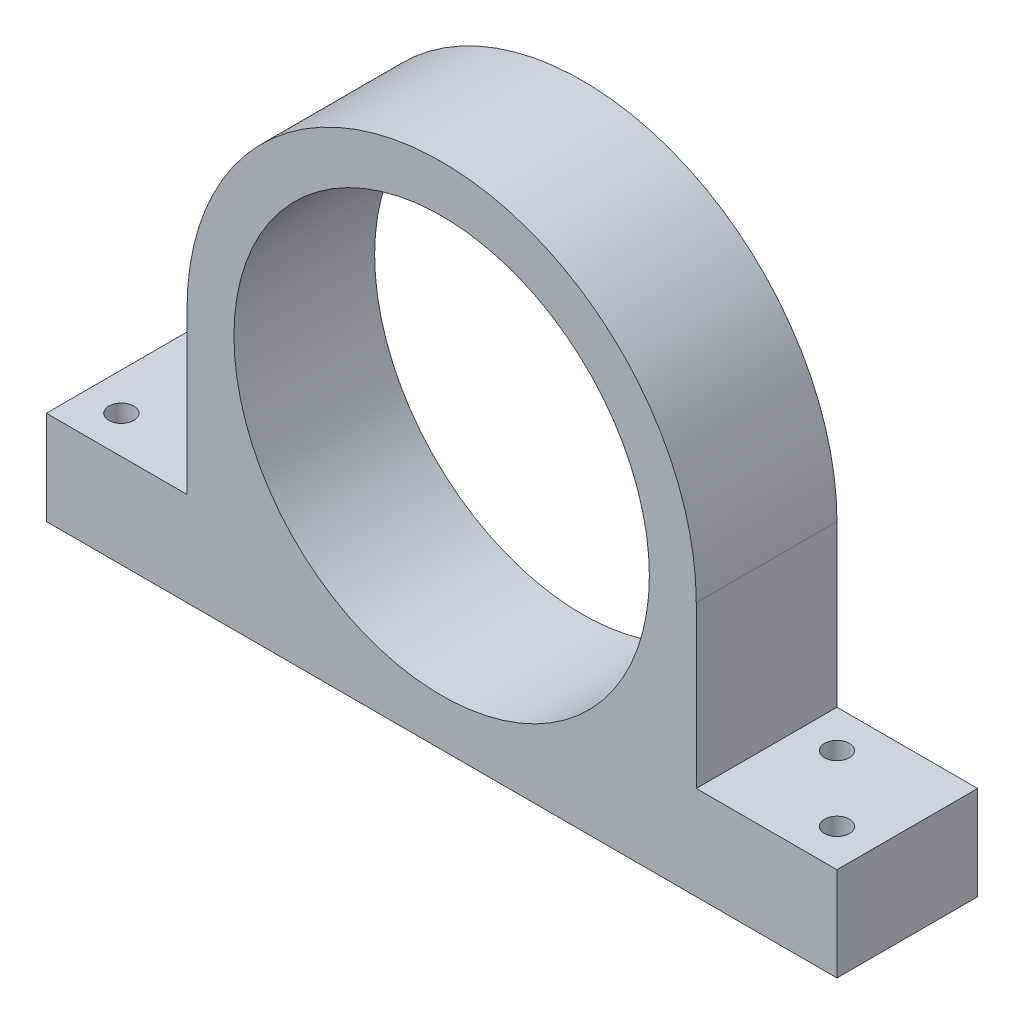
ISO-10303-21;
HEADER;
FILE_DESCRIPTION(('STEP AP214'),'2;1');
FILE_NAME('part.step','',(''),(''),'','','');
FILE_SCHEMA(('AUTOMOTIVE_DESIGN { 1 0 10303 214 1 1 1 1 }'));
ENDSEC;
DATA;
#1=APPLICATION_CONTEXT('core data for automotive mechanical design processes');
#2=APPLICATION_PROTOCOL_DEFINITION('international standard','automotive_design',2000,#1);
#3=PRODUCT_CONTEXT('',#1,'mechanical');
#4=PRODUCT('Part','Part','',(#3));
#5=PRODUCT_RELATED_PRODUCT_CATEGORY('part','',(#4));
#6=PRODUCT_DEFINITION_FORMATION('','',#4);
#7=PRODUCT_DEFINITION_CONTEXT('part definition',#1,'design');
#8=PRODUCT_DEFINITION('design','',#6,#7);
#9=PRODUCT_DEFINITION_SHAPE('','',#8);
#10=(LENGTH_UNIT() NAMED_UNIT(*) SI_UNIT(.MILLI.,.METRE.));
#11=(NAMED_UNIT(*) PLANE_ANGLE_UNIT() SI_UNIT($,.RADIAN.));
#12=(NAMED_UNIT(*) SI_UNIT($,.STERADIAN.) SOLID_ANGLE_UNIT());
#13=UNCERTAINTY_MEASURE_WITH_UNIT(LENGTH_MEASURE(1.E-05),#10,'distance_accuracy_value','');
#14=(GEOMETRIC_REPRESENTATION_CONTEXT(3) GLOBAL_UNCERTAINTY_ASSIGNED_CONTEXT((#13)) GLOBAL_UNIT_ASSIGNED_CONTEXT((#10,
#11,#12)) REPRESENTATION_CONTEXT('',''));
#15=CARTESIAN_POINT('',(0.,0.,0.));
#16=DIRECTION('',(0.,0.,1.));
#17=DIRECTION('',(1.,0.,0.));
#18=AXIS2_PLACEMENT_3D('',#15,#16,#17);
#19=CARTESIAN_POINT('',(0.,27.58059,7.62));
#20=DIRECTION('',(0.,0.,1.));
#21=DIRECTION('',(1.,0.,0.));
#22=AXIS2_PLACEMENT_3D('',#19,#20,#21);
#23=PLANE('',#22);
#24=CARTESIAN_POINT('',(0.,27.58059,7.62));
#25=DIRECTION('',(0.,0.,1.));
#26=DIRECTION('',(1.,0.,0.));
#27=AXIS2_PLACEMENT_3D('',#24,#25,#26);
#28=CIRCLE('',#27,27.58059);
#29=CARTESIAN_POINT('',(27.58059,27.58059,7.62));
#30=VERTEX_POINT('',#29);
#31=CARTESIAN_POINT('',(-27.58059,27.58059,7.62));
#32=VERTEX_POINT('',#31);
#33=EDGE_CURVE('E147',#30,#32,#28,.T.);
#34=ORIENTED_EDGE('',*,*,#33,.T.);
#35=DIRECTION('',(0.,-1.,0.));
#36=VECTOR('',#35,1.);
#37=CARTESIAN_POINT('',(-27.58059,27.58059,7.62));
#38=LINE('',#37,#36);
#39=CARTESIAN_POINT('',(-27.58059,10.16,7.62));
#40=VERTEX_POINT('',#39);
#41=EDGE_CURVE('E95',#32,#40,#38,.T.);
#42=ORIENTED_EDGE('',*,*,#41,.T.);
#43=DIRECTION('',(-1.,0.,0.));
#44=VECTOR('',#43,1.);
#45=CARTESIAN_POINT('',(-42.82059,10.16,7.62));
#46=LINE('',#45,#44);
#47=CARTESIAN_POINT('',(-42.82059,10.16,7.62));
#48=VERTEX_POINT('',#47);
#49=EDGE_CURVE('E162',#40,#48,#46,.T.);
#50=ORIENTED_EDGE('',*,*,#49,.T.);
#51=DIRECTION('',(0.,-1.,0.));
#52=VECTOR('',#51,1.);
#53=CARTESIAN_POINT('',(-42.82059,0.,7.62));
#54=LINE('',#53,#52);
#55=CARTESIAN_POINT('',(-42.82059,0.,7.62));
#56=VERTEX_POINT('',#55);
#57=EDGE_CURVE('E175',#48,#56,#54,.T.);
#58=ORIENTED_EDGE('',*,*,#57,.T.);
#59=DIRECTION('',(1.,0.,0.));
#60=VECTOR('',#59,1.);
#61=CARTESIAN_POINT('',(42.82059,0.,7.62));
#62=LINE('',#61,#60);
#63=CARTESIAN_POINT('',(42.82059,0.,7.62));
#64=VERTEX_POINT('',#63);
#65=EDGE_CURVE('E114',#56,#64,#62,.T.);
#66=ORIENTED_EDGE('',*,*,#65,.T.);
#67=DIRECTION('',(0.,1.,0.));
#68=VECTOR('',#67,1.);
#69=CARTESIAN_POINT('',(42.82059,0.,7.62));
#70=LINE('',#69,#68);
#71=CARTESIAN_POINT('',(42.82059,10.16,7.62));
#72=VERTEX_POINT('',#71);
#73=EDGE_CURVE('E108',#64,#72,#70,.T.);
#74=ORIENTED_EDGE('',*,*,#73,.T.);
#75=DIRECTION('',(-1.,0.,0.));
#76=VECTOR('',#75,1.);
#77=CARTESIAN_POINT('',(42.82059,10.16,7.62));
#78=LINE('',#77,#76);
#79=CARTESIAN_POINT('',(27.58059,10.16,7.62));
#80=VERTEX_POINT('',#79);
#81=EDGE_CURVE('E112',#72,#80,#78,.T.);
#82=ORIENTED_EDGE('',*,*,#81,.T.);
#83=DIRECTION('',(0.,1.,0.));
#84=VECTOR('',#83,1.);
#85=CARTESIAN_POINT('',(27.58059,27.58059,7.62));
#86=LINE('',#85,#84);
#87=EDGE_CURVE('E52',#80,#30,#86,.T.);
#88=ORIENTED_EDGE('',*,*,#87,.T.);
#89=EDGE_LOOP('',(#34,#42,#50,#58,#66,#74,#82,#88));
#90=FACE_BOUND('',#89,.T.);
#91=CARTESIAN_POINT('',(0.,27.58059,7.62));
#92=DIRECTION('',(0.,0.,1.));
#93=DIRECTION('',(1.,0.,0.));
#94=AXIS2_PLACEMENT_3D('',#91,#92,#93);
#95=CIRCLE('',#94,22.50059);
#96=CARTESIAN_POINT('',(-22.50059,27.58059,7.62));
#97=VERTEX_POINT('',#96);
#98=EDGE_CURVE('E136',#97,#97,#95,.T.);
#99=ORIENTED_EDGE('',*,*,#98,.F.);
#100=EDGE_LOOP('',(#99));
#101=FACE_BOUND('',#100,.T.);
#102=ADVANCED_FACE('F35',(#90,#101),#23,.T.);
#103=CARTESIAN_POINT('',(0.,27.58059,-7.62));
#104=DIRECTION('',(0.,0.,1.));
#105=DIRECTION('',(1.,0.,0.));
#106=AXIS2_PLACEMENT_3D('',#103,#104,#105);
#107=PLANE('',#106);
#108=CARTESIAN_POINT('',(0.,27.58059,-7.62));
#109=DIRECTION('',(0.,0.,1.));
#110=DIRECTION('',(1.,0.,0.));
#111=AXIS2_PLACEMENT_3D('',#108,#109,#110);
#112=CIRCLE('',#111,27.58059);
#113=CARTESIAN_POINT('',(27.58059,27.58059,-7.62));
#114=VERTEX_POINT('',#113);
#115=CARTESIAN_POINT('',(-27.58059,27.58059,-7.62));
#116=VERTEX_POINT('',#115);
#117=EDGE_CURVE('E132',#114,#116,#112,.T.);
#118=ORIENTED_EDGE('',*,*,#117,.F.);
#119=DIRECTION('',(0.,1.,0.));
#120=VECTOR('',#119,1.);
#121=CARTESIAN_POINT('',(27.58059,27.58059,-7.62));
#122=LINE('',#121,#120);
#123=CARTESIAN_POINT('',(27.58059,10.16,-7.62));
#124=VERTEX_POINT('',#123);
#125=EDGE_CURVE('E87',#124,#114,#122,.T.);
#126=ORIENTED_EDGE('',*,*,#125,.F.);
#127=DIRECTION('',(-1.,0.,0.));
#128=VECTOR('',#127,1.);
#129=CARTESIAN_POINT('',(42.82059,10.16,-7.62));
#130=LINE('',#129,#128);
#131=CARTESIAN_POINT('',(42.82059,10.16,-7.62));
#132=VERTEX_POINT('',#131);
#133=EDGE_CURVE('E81',#132,#124,#130,.T.);
#134=ORIENTED_EDGE('',*,*,#133,.F.);
#135=DIRECTION('',(0.,1.,0.));
#136=VECTOR('',#135,1.);
#137=CARTESIAN_POINT('',(42.82059,0.,-7.62));
#138=LINE('',#137,#136);
#139=CARTESIAN_POINT('',(42.82059,0.,-7.62));
#140=VERTEX_POINT('',#139);
#141=EDGE_CURVE('E122',#140,#132,#138,.T.);
#142=ORIENTED_EDGE('',*,*,#141,.F.);
#143=DIRECTION('',(1.,0.,0.));
#144=VECTOR('',#143,1.);
#145=CARTESIAN_POINT('',(42.82059,0.,-7.62));
#146=LINE('',#145,#144);
#147=CARTESIAN_POINT('',(-42.82059,0.,-7.62));
#148=VERTEX_POINT('',#147);
#149=EDGE_CURVE('E142',#148,#140,#146,.T.);
#150=ORIENTED_EDGE('',*,*,#149,.F.);
#151=DIRECTION('',(0.,-1.,0.));
#152=VECTOR('',#151,1.);
#153=CARTESIAN_POINT('',(-42.82059,0.,-7.62));
#154=LINE('',#153,#152);
#155=CARTESIAN_POINT('',(-42.82059,10.16,-7.62));
#156=VERTEX_POINT('',#155);
#157=EDGE_CURVE('E140',#156,#148,#154,.T.);
#158=ORIENTED_EDGE('',*,*,#157,.F.);
#159=DIRECTION('',(-1.,0.,0.));
#160=VECTOR('',#159,1.);
#161=CARTESIAN_POINT('',(-42.82059,10.16,-7.62));
#162=LINE('',#161,#160);
#163=CARTESIAN_POINT('',(-27.58059,10.16,-7.62));
#164=VERTEX_POINT('',#163);
#165=EDGE_CURVE('E138',#164,#156,#162,.T.);
#166=ORIENTED_EDGE('',*,*,#165,.F.);
#167=DIRECTION('',(0.,-1.,0.));
#168=VECTOR('',#167,1.);
#169=CARTESIAN_POINT('',(-27.58059,27.58059,-7.62));
#170=LINE('',#169,#168);
#171=EDGE_CURVE('E135',#116,#164,#170,.T.);
#172=ORIENTED_EDGE('',*,*,#171,.F.);
#173=EDGE_LOOP('',(#118,#126,#134,#142,#150,#158,#166,#172));
#174=FACE_BOUND('',#173,.T.);
#175=CARTESIAN_POINT('',(0.,27.58059,-7.62));
#176=DIRECTION('',(0.,0.,1.));
#177=DIRECTION('',(1.,0.,0.));
#178=AXIS2_PLACEMENT_3D('',#175,#176,#177);
#179=CIRCLE('',#178,22.50059);
#180=CARTESIAN_POINT('',(-22.50059,27.58059,-7.62));
#181=VERTEX_POINT('',#180);
#182=EDGE_CURVE('E181',#181,#181,#179,.T.);
#183=ORIENTED_EDGE('',*,*,#182,.T.);
#184=EDGE_LOOP('',(#183));
#185=FACE_BOUND('',#184,.T.);
#186=ADVANCED_FACE('F166',(#174,#185),#107,.F.);
#187=CARTESIAN_POINT('',(0.,27.58059,7.62));
#188=DIRECTION('',(0.,0.,-1.));
#189=DIRECTION('',(-1.,0.,0.));
#190=AXIS2_PLACEMENT_3D('',#187,#188,#189);
#191=CYLINDRICAL_SURFACE('',#190,27.58059);
#192=ORIENTED_EDGE('',*,*,#117,.T.);
#193=DIRECTION('',(0.,0.,-1.));
#194=VECTOR('',#193,1.);
#195=CARTESIAN_POINT('',(-27.58059,27.58059,7.62));
#196=LINE('',#195,#194);
#197=EDGE_CURVE('E11',#32,#116,#196,.T.);
#198=ORIENTED_EDGE('',*,*,#197,.F.);
#199=ORIENTED_EDGE('',*,*,#33,.F.);
#200=DIRECTION('',(0.,0.,-1.));
#201=VECTOR('',#200,1.);
#202=CARTESIAN_POINT('',(27.58059,27.58059,7.62));
#203=LINE('',#202,#201);
#204=EDGE_CURVE('E128',#30,#114,#203,.T.);
#205=ORIENTED_EDGE('',*,*,#204,.T.);
#206=EDGE_LOOP('',(#192,#198,#199,#205));
#207=FACE_BOUND('',#206,.T.);
#208=ADVANCED_FACE('F37',(#207),#191,.T.);
#209=CARTESIAN_POINT('',(-27.58059,27.58059,7.62));
#210=DIRECTION('',(1.,0.,0.));
#211=DIRECTION('',(0.,0.,-1.));
#212=AXIS2_PLACEMENT_3D('',#209,#210,#211);
#213=PLANE('',#212);
#214=ORIENTED_EDGE('',*,*,#171,.T.);
#215=DIRECTION('',(0.,0.,-1.));
#216=VECTOR('',#215,1.);
#217=CARTESIAN_POINT('',(-27.58059,10.16,7.62));
#218=LINE('',#217,#216);
#219=EDGE_CURVE('E44',#40,#164,#218,.T.);
#220=ORIENTED_EDGE('',*,*,#219,.F.);
#221=ORIENTED_EDGE('',*,*,#41,.F.);
#222=ORIENTED_EDGE('',*,*,#197,.T.);
#223=EDGE_LOOP('',(#214,#220,#221,#222));
#224=FACE_BOUND('',#223,.T.);
#225=ADVANCED_FACE('F215',(#224),#213,.F.);
#226=CARTESIAN_POINT('',(-42.82059,10.16,7.62));
#227=DIRECTION('',(0.,-1.,0.));
#228=DIRECTION('',(0.,0.,-1.));
#229=AXIS2_PLACEMENT_3D('',#226,#227,#228);
#230=PLANE('',#229);
#231=CARTESIAN_POINT('',(-38.75659,10.16,3.556));
#232=DIRECTION('',(0.,1.,0.));
#233=DIRECTION('',(0.,0.,1.));
#234=AXIS2_PLACEMENT_3D('',#231,#232,#233);
#235=CIRCLE('',#234,1.35254999999999);
#236=CARTESIAN_POINT('',(-38.75659,10.16,4.90854999999999));
#237=VERTEX_POINT('',#236);
#238=EDGE_CURVE('E207',#237,#237,#235,.T.);
#239=ORIENTED_EDGE('',*,*,#238,.F.);
#240=EDGE_LOOP('',(#239));
#241=FACE_BOUND('',#240,.T.);
#242=CARTESIAN_POINT('',(-31.64459,10.16,-3.556));
#243=DIRECTION('',(0.,1.,0.));
#244=DIRECTION('',(0.,0.,1.));
#245=AXIS2_PLACEMENT_3D('',#242,#243,#244);
#246=CIRCLE('',#245,1.35254999999999);
#247=CARTESIAN_POINT('',(-31.64459,10.16,-2.20345000000001));
#248=VERTEX_POINT('',#247);
#249=EDGE_CURVE('E201',#248,#248,#246,.T.);
#250=ORIENTED_EDGE('',*,*,#249,.F.);
#251=EDGE_LOOP('',(#250));
#252=FACE_BOUND('',#251,.T.);
#253=ORIENTED_EDGE('',*,*,#165,.T.);
#254=DIRECTION('',(0.,0.,-1.));
#255=VECTOR('',#254,1.);
#256=CARTESIAN_POINT('',(-42.82059,10.16,7.62));
#257=LINE('',#256,#255);
#258=EDGE_CURVE('E154',#48,#156,#257,.T.);
#259=ORIENTED_EDGE('',*,*,#258,.F.);
#260=ORIENTED_EDGE('',*,*,#49,.F.);
#261=ORIENTED_EDGE('',*,*,#219,.T.);
#262=EDGE_LOOP('',(#253,#259,#260,#261));
#263=FACE_BOUND('',#262,.T.);
#264=ADVANCED_FACE('F160',(#241,#252,#263),#230,.F.);
#265=CARTESIAN_POINT('',(-42.82059,0.,7.62));
#266=DIRECTION('',(1.,0.,0.));
#267=DIRECTION('',(0.,0.,-1.));
#268=AXIS2_PLACEMENT_3D('',#265,#266,#267);
#269=PLANE('',#268);
#270=ORIENTED_EDGE('',*,*,#157,.T.);
#271=DIRECTION('',(0.,0.,-1.));
#272=VECTOR('',#271,1.);
#273=CARTESIAN_POINT('',(-42.82059,0.,7.62));
#274=LINE('',#273,#272);
#275=EDGE_CURVE('E151',#56,#148,#274,.T.);
#276=ORIENTED_EDGE('',*,*,#275,.F.);
#277=ORIENTED_EDGE('',*,*,#57,.F.);
#278=ORIENTED_EDGE('',*,*,#258,.T.);
#279=EDGE_LOOP('',(#270,#276,#277,#278));
#280=FACE_BOUND('',#279,.T.);
#281=ADVANCED_FACE('F171',(#280),#269,.F.);
#282=CARTESIAN_POINT('',(42.82059,0.,7.62));
#283=DIRECTION('',(0.,1.,0.));
#284=DIRECTION('',(-1.,0.,0.));
#285=AXIS2_PLACEMENT_3D('',#282,#283,#284);
#286=PLANE('',#285);
#287=CARTESIAN_POINT('',(-38.75659,0.,3.556));
#288=DIRECTION('',(0.,1.,0.));
#289=DIRECTION('',(0.,0.,1.));
#290=AXIS2_PLACEMENT_3D('',#287,#288,#289);
#291=CIRCLE('',#290,1.35255);
#292=CARTESIAN_POINT('',(-38.75659,0.,4.90855));
#293=VERTEX_POINT('',#292);
#294=EDGE_CURVE('E204',#293,#293,#291,.T.);
#295=ORIENTED_EDGE('',*,*,#294,.T.);
#296=EDGE_LOOP('',(#295));
#297=FACE_BOUND('',#296,.T.);
#298=CARTESIAN_POINT('',(-31.64459,0.,-3.556));
#299=DIRECTION('',(0.,1.,0.));
#300=DIRECTION('',(0.,0.,1.));
#301=AXIS2_PLACEMENT_3D('',#298,#299,#300);
#302=CIRCLE('',#301,1.35255);
#303=CARTESIAN_POINT('',(-31.64459,0.,-2.20345));
#304=VERTEX_POINT('',#303);
#305=EDGE_CURVE('E198',#304,#304,#302,.T.);
#306=ORIENTED_EDGE('',*,*,#305,.T.);
#307=EDGE_LOOP('',(#306));
#308=FACE_BOUND('',#307,.T.);
#309=CARTESIAN_POINT('',(31.64459,0.,-3.556));
#310=DIRECTION('',(0.,1.,0.));
#311=DIRECTION('',(0.,0.,1.));
#312=AXIS2_PLACEMENT_3D('',#309,#310,#311);
#313=CIRCLE('',#312,1.35255);
#314=CARTESIAN_POINT('',(31.64459,0.,-2.20345));
#315=VERTEX_POINT('',#314);
#316=EDGE_CURVE('E192',#315,#315,#313,.T.);
#317=ORIENTED_EDGE('',*,*,#316,.T.);
#318=EDGE_LOOP('',(#317));
#319=FACE_BOUND('',#318,.T.);
#320=CARTESIAN_POINT('',(38.75659,0.,3.556));
#321=DIRECTION('',(0.,1.,0.));
#322=DIRECTION('',(0.,0.,1.));
#323=AXIS2_PLACEMENT_3D('',#320,#321,#322);
#324=CIRCLE('',#323,1.35255);
#325=CARTESIAN_POINT('',(38.75659,0.,4.90855));
#326=VERTEX_POINT('',#325);
#327=EDGE_CURVE('E184',#326,#326,#324,.T.);
#328=ORIENTED_EDGE('',*,*,#327,.T.);
#329=EDGE_LOOP('',(#328));
#330=FACE_BOUND('',#329,.T.);
#331=ORIENTED_EDGE('',*,*,#149,.T.);
#332=DIRECTION('',(0.,0.,-1.));
#333=VECTOR('',#332,1.);
#334=CARTESIAN_POINT('',(42.82059,0.,7.62));
#335=LINE('',#334,#333);
#336=EDGE_CURVE('E123',#64,#140,#335,.T.);
#337=ORIENTED_EDGE('',*,*,#336,.F.);
#338=ORIENTED_EDGE('',*,*,#65,.F.);
#339=ORIENTED_EDGE('',*,*,#275,.T.);
#340=EDGE_LOOP('',(#331,#337,#338,#339));
#341=FACE_BOUND('',#340,.T.);
#342=ADVANCED_FACE('F174',(#297,#308,#319,#330,#341),#286,.F.);
#343=CARTESIAN_POINT('',(42.82059,0.,7.62));
#344=DIRECTION('',(-1.,0.,0.));
#345=DIRECTION('',(0.,0.,1.));
#346=AXIS2_PLACEMENT_3D('',#343,#344,#345);
#347=PLANE('',#346);
#348=ORIENTED_EDGE('',*,*,#141,.T.);
#349=DIRECTION('',(0.,0.,-1.));
#350=VECTOR('',#349,1.);
#351=CARTESIAN_POINT('',(42.82059,10.16,7.62));
#352=LINE('',#351,#350);
#353=EDGE_CURVE('E119',#72,#132,#352,.T.);
#354=ORIENTED_EDGE('',*,*,#353,.F.);
#355=ORIENTED_EDGE('',*,*,#73,.F.);
#356=ORIENTED_EDGE('',*,*,#336,.T.);
#357=EDGE_LOOP('',(#348,#354,#355,#356));
#358=FACE_BOUND('',#357,.T.);
#359=ADVANCED_FACE('F120',(#358),#347,.F.);
#360=CARTESIAN_POINT('',(42.82059,10.16,7.62));
#361=DIRECTION('',(0.,-1.,0.));
#362=DIRECTION('',(0.,0.,-1.));
#363=AXIS2_PLACEMENT_3D('',#360,#361,#362);
#364=PLANE('',#363);
#365=CARTESIAN_POINT('',(31.64459,10.16,-3.556));
#366=DIRECTION('',(0.,1.,0.));
#367=DIRECTION('',(0.,0.,1.));
#368=AXIS2_PLACEMENT_3D('',#365,#366,#367);
#369=CIRCLE('',#368,1.35254999999999);
#370=CARTESIAN_POINT('',(31.64459,10.16,-2.20345000000001));
#371=VERTEX_POINT('',#370);
#372=EDGE_CURVE('E195',#371,#371,#369,.T.);
#373=ORIENTED_EDGE('',*,*,#372,.F.);
#374=EDGE_LOOP('',(#373));
#375=FACE_BOUND('',#374,.T.);
#376=CARTESIAN_POINT('',(38.75659,10.16,3.556));
#377=DIRECTION('',(0.,1.,0.));
#378=DIRECTION('',(0.,0.,1.));
#379=AXIS2_PLACEMENT_3D('',#376,#377,#378);
#380=CIRCLE('',#379,1.35254999999999);
#381=CARTESIAN_POINT('',(38.75659,10.16,4.90854999999999));
#382=VERTEX_POINT('',#381);
#383=EDGE_CURVE('E189',#382,#382,#380,.T.);
#384=ORIENTED_EDGE('',*,*,#383,.F.);
#385=EDGE_LOOP('',(#384));
#386=FACE_BOUND('',#385,.T.);
#387=ORIENTED_EDGE('',*,*,#133,.T.);
#388=DIRECTION('',(0.,0.,-1.));
#389=VECTOR('',#388,1.);
#390=CARTESIAN_POINT('',(27.58059,10.16,7.62));
#391=LINE('',#390,#389);
#392=EDGE_CURVE('E124',#80,#124,#391,.T.);
#393=ORIENTED_EDGE('',*,*,#392,.F.);
#394=ORIENTED_EDGE('',*,*,#81,.F.);
#395=ORIENTED_EDGE('',*,*,#353,.T.);
#396=EDGE_LOOP('',(#387,#393,#394,#395));
#397=FACE_BOUND('',#396,.T.);
#398=ADVANCED_FACE('F126',(#375,#386,#397),#364,.F.);
#399=CARTESIAN_POINT('',(27.58059,27.58059,7.62));
#400=DIRECTION('',(-1.,0.,0.));
#401=DIRECTION('',(0.,-1.,0.));
#402=AXIS2_PLACEMENT_3D('',#399,#400,#401);
#403=PLANE('',#402);
#404=ORIENTED_EDGE('',*,*,#125,.T.);
#405=ORIENTED_EDGE('',*,*,#204,.F.);
#406=ORIENTED_EDGE('',*,*,#87,.F.);
#407=ORIENTED_EDGE('',*,*,#392,.T.);
#408=EDGE_LOOP('',(#404,#405,#406,#407));
#409=FACE_BOUND('',#408,.T.);
#410=ADVANCED_FACE('F244',(#409),#403,.F.);
#411=CARTESIAN_POINT('',(0.,27.58059,7.62));
#412=DIRECTION('',(0.,0.,-1.));
#413=DIRECTION('',(-1.,0.,0.));
#414=AXIS2_PLACEMENT_3D('',#411,#412,#413);
#415=CYLINDRICAL_SURFACE('',#414,22.50059);
#416=CARTESIAN_POINT('',(-22.50059,27.58059,7.62));
#417=CARTESIAN_POINT('',(-22.50059,27.58059,7.46125));
#418=CARTESIAN_POINT('',(-22.50059,27.58059,7.3025));
#419=CARTESIAN_POINT('',(-22.50059,27.58059,6.985));
#420=CARTESIAN_POINT('',(-22.50059,27.58059,6.82625));
#421=CARTESIAN_POINT('',(-22.50059,27.58059,6.50875));
#422=CARTESIAN_POINT('',(-22.50059,27.58059,6.35));
#423=CARTESIAN_POINT('',(-22.50059,27.58059,6.0325));
#424=CARTESIAN_POINT('',(-22.50059,27.58059,5.87375));
#425=CARTESIAN_POINT('',(-22.50059,27.58059,5.55625));
#426=CARTESIAN_POINT('',(-22.50059,27.58059,5.3975));
#427=CARTESIAN_POINT('',(-22.50059,27.58059,5.08));
#428=CARTESIAN_POINT('',(-22.50059,27.58059,4.92125));
#429=CARTESIAN_POINT('',(-22.50059,27.58059,4.60375));
#430=CARTESIAN_POINT('',(-22.50059,27.58059,4.445));
#431=CARTESIAN_POINT('',(-22.50059,27.58059,4.1275));
#432=CARTESIAN_POINT('',(-22.50059,27.58059,3.96875));
#433=CARTESIAN_POINT('',(-22.50059,27.58059,3.65125));
#434=CARTESIAN_POINT('',(-22.50059,27.58059,3.4925));
#435=CARTESIAN_POINT('',(-22.50059,27.58059,3.175));
#436=CARTESIAN_POINT('',(-22.50059,27.58059,3.01625));
#437=CARTESIAN_POINT('',(-22.50059,27.58059,2.69875));
#438=CARTESIAN_POINT('',(-22.50059,27.58059,2.54));
#439=CARTESIAN_POINT('',(-22.50059,27.58059,2.2225));
#440=CARTESIAN_POINT('',(-22.50059,27.58059,2.06375));
#441=CARTESIAN_POINT('',(-22.50059,27.58059,1.74625));
#442=CARTESIAN_POINT('',(-22.50059,27.58059,1.5875));
#443=CARTESIAN_POINT('',(-22.50059,27.58059,1.27));
#444=CARTESIAN_POINT('',(-22.50059,27.58059,1.11125));
#445=CARTESIAN_POINT('',(-22.50059,27.58059,0.79375));
#446=CARTESIAN_POINT('',(-22.50059,27.58059,0.635));
#447=CARTESIAN_POINT('',(-22.50059,27.58059,0.3175));
#448=CARTESIAN_POINT('',(-22.50059,27.58059,0.15875));
#449=CARTESIAN_POINT('',(-22.50059,27.58059,-0.15875));
#450=CARTESIAN_POINT('',(-22.50059,27.58059,-0.3175));
#451=CARTESIAN_POINT('',(-22.50059,27.58059,-0.635));
#452=CARTESIAN_POINT('',(-22.50059,27.58059,-0.79375));
#453=CARTESIAN_POINT('',(-22.50059,27.58059,-1.11125));
#454=CARTESIAN_POINT('',(-22.50059,27.58059,-1.27));
#455=CARTESIAN_POINT('',(-22.50059,27.58059,-1.5875));
#456=CARTESIAN_POINT('',(-22.50059,27.58059,-1.74625));
#457=CARTESIAN_POINT('',(-22.50059,27.58059,-2.06375));
#458=CARTESIAN_POINT('',(-22.50059,27.58059,-2.2225));
#459=CARTESIAN_POINT('',(-22.50059,27.58059,-2.54));
#460=CARTESIAN_POINT('',(-22.50059,27.58059,-2.69875));
#461=CARTESIAN_POINT('',(-22.50059,27.58059,-3.01625));
#462=CARTESIAN_POINT('',(-22.50059,27.58059,-3.175));
#463=CARTESIAN_POINT('',(-22.50059,27.58059,-3.4925));
#464=CARTESIAN_POINT('',(-22.50059,27.58059,-3.65125));
#465=CARTESIAN_POINT('',(-22.50059,27.58059,-3.96875));
#466=CARTESIAN_POINT('',(-22.50059,27.58059,-4.1275));
#467=CARTESIAN_POINT('',(-22.50059,27.58059,-4.445));
#468=CARTESIAN_POINT('',(-22.50059,27.58059,-4.60375));
#469=CARTESIAN_POINT('',(-22.50059,27.58059,-4.92125));
#470=CARTESIAN_POINT('',(-22.50059,27.58059,-5.08));
#471=CARTESIAN_POINT('',(-22.50059,27.58059,-5.3975));
#472=CARTESIAN_POINT('',(-22.50059,27.58059,-5.55625));
#473=CARTESIAN_POINT('',(-22.50059,27.58059,-5.87375));
#474=CARTESIAN_POINT('',(-22.50059,27.58059,-6.0325));
#475=CARTESIAN_POINT('',(-22.50059,27.58059,-6.35));
#476=CARTESIAN_POINT('',(-22.50059,27.58059,-6.50875));
#477=CARTESIAN_POINT('',(-22.50059,27.58059,-6.82625));
#478=CARTESIAN_POINT('',(-22.50059,27.58059,-6.985));
#479=CARTESIAN_POINT('',(-22.50059,27.58059,-7.3025));
#480=CARTESIAN_POINT('',(-22.50059,27.58059,-7.46125));
#481=CARTESIAN_POINT('',(-22.50059,27.58059,-7.62));
#482=B_SPLINE_CURVE_WITH_KNOTS('',3,(#416,#417,#418,#419,#420,#421,#422,#423,#424,#425,#426,
#427,#428,#429,#430,#431,#432,#433,#434,#435,#436,#437,#438,#439,#440,#441,#442,#443,#444,#445,
#446,#447,#448,#449,#450,#451,#452,#453,#454,#455,#456,#457,#458,#459,#460,#461,#462,#463,#464,
#465,#466,#467,#468,#469,#470,#471,#472,#473,#474,#475,#476,#477,#478,#479,#480,#481),
.UNSPECIFIED.,.F.,.F.,(4,2,2,2,2,2,2,2,2,2,2,2,2,2,2,2,2,2,2,2,2,2,2,2,2,2,2,2,2,2,2,2,4),(0.,
0.47625,0.9525,1.42875,1.905,2.38125,2.8575,3.33375,3.81,4.28625,4.7625,5.23875,5.715,6.19125,
6.6675,7.14375,7.62,8.09625,8.5725,9.04875,9.525,10.00125,10.4775,10.95375,11.43,11.90625,
12.3825,12.85875,13.335,13.81125,14.2875,14.76375,15.24),.UNSPECIFIED.);
#483=EDGE_CURVE('BSEAM241',#97,#181,#482,.T.);
#484=ORIENTED_EDGE('',*,*,#98,.T.);
#485=ORIENTED_EDGE('',*,*,#182,.F.);
#486=ORIENTED_EDGE('',*,*,#483,.T.);
#487=ORIENTED_EDGE('',*,*,#483,.F.);
#488=EDGE_LOOP('',(#484,#486,#485,#487));
#489=FACE_BOUND('',#488,.T.);
#490=ADVANCED_FACE('F241',(#489),#415,.F.);
#491=CARTESIAN_POINT('',(38.75659,10.16,3.556));
#492=DIRECTION('',(0.,1.,0.));
#493=DIRECTION('',(0.,0.,1.));
#494=AXIS2_PLACEMENT_3D('',#491,#492,#493);
#495=CYLINDRICAL_SURFACE('',#494,1.35254999999999);
#496=ORIENTED_EDGE('',*,*,#327,.F.);
#497=EDGE_LOOP('',(#496));
#498=FACE_BOUND('',#497,.T.);
#499=ORIENTED_EDGE('',*,*,#383,.T.);
#500=EDGE_LOOP('',(#499));
#501=FACE_BOUND('',#500,.T.);
#502=ADVANCED_FACE('F230',(#498,#501),#495,.F.);
#503=CARTESIAN_POINT('',(31.64459,10.16,-3.556));
#504=DIRECTION('',(0.,1.,0.));
#505=DIRECTION('',(0.,0.,1.));
#506=AXIS2_PLACEMENT_3D('',#503,#504,#505);
#507=CYLINDRICAL_SURFACE('',#506,1.35254999999999);
#508=ORIENTED_EDGE('',*,*,#316,.F.);
#509=EDGE_LOOP('',(#508));
#510=FACE_BOUND('',#509,.T.);
#511=ORIENTED_EDGE('',*,*,#372,.T.);
#512=EDGE_LOOP('',(#511));
#513=FACE_BOUND('',#512,.T.);
#514=ADVANCED_FACE('F221',(#510,#513),#507,.F.);
#515=CARTESIAN_POINT('',(-31.64459,10.16,-3.556));
#516=DIRECTION('',(0.,1.,0.));
#517=DIRECTION('',(0.,0.,1.));
#518=AXIS2_PLACEMENT_3D('',#515,#516,#517);
#519=CYLINDRICAL_SURFACE('',#518,1.35254999999999);
#520=ORIENTED_EDGE('',*,*,#305,.F.);
#521=EDGE_LOOP('',(#520));
#522=FACE_BOUND('',#521,.T.);
#523=ORIENTED_EDGE('',*,*,#249,.T.);
#524=EDGE_LOOP('',(#523));
#525=FACE_BOUND('',#524,.T.);
#526=ADVANCED_FACE('F219',(#522,#525),#519,.F.);
#527=CARTESIAN_POINT('',(-38.75659,10.16,3.556));
#528=DIRECTION('',(0.,1.,0.));
#529=DIRECTION('',(0.,0.,1.));
#530=AXIS2_PLACEMENT_3D('',#527,#528,#529);
#531=CYLINDRICAL_SURFACE('',#530,1.35254999999999);
#532=ORIENTED_EDGE('',*,*,#294,.F.);
#533=EDGE_LOOP('',(#532));
#534=FACE_BOUND('',#533,.T.);
#535=ORIENTED_EDGE('',*,*,#238,.T.);
#536=EDGE_LOOP('',(#535));
#537=FACE_BOUND('',#536,.T.);
#538=ADVANCED_FACE('F211',(#534,#537),#531,.F.);
#539=CLOSED_SHELL('',(#102,#186,#208,#225,#264,#281,#342,#359,#398,#410,#490,#502,#514,#526,#538));
#540=MANIFOLD_SOLID_BREP('B2',#539);
#541=ADVANCED_BREP_SHAPE_REPRESENTATION('',(#18,#540),#14);
#542=SHAPE_DEFINITION_REPRESENTATION(#9,#541);
ENDSEC;
END-ISO-10303-21;
